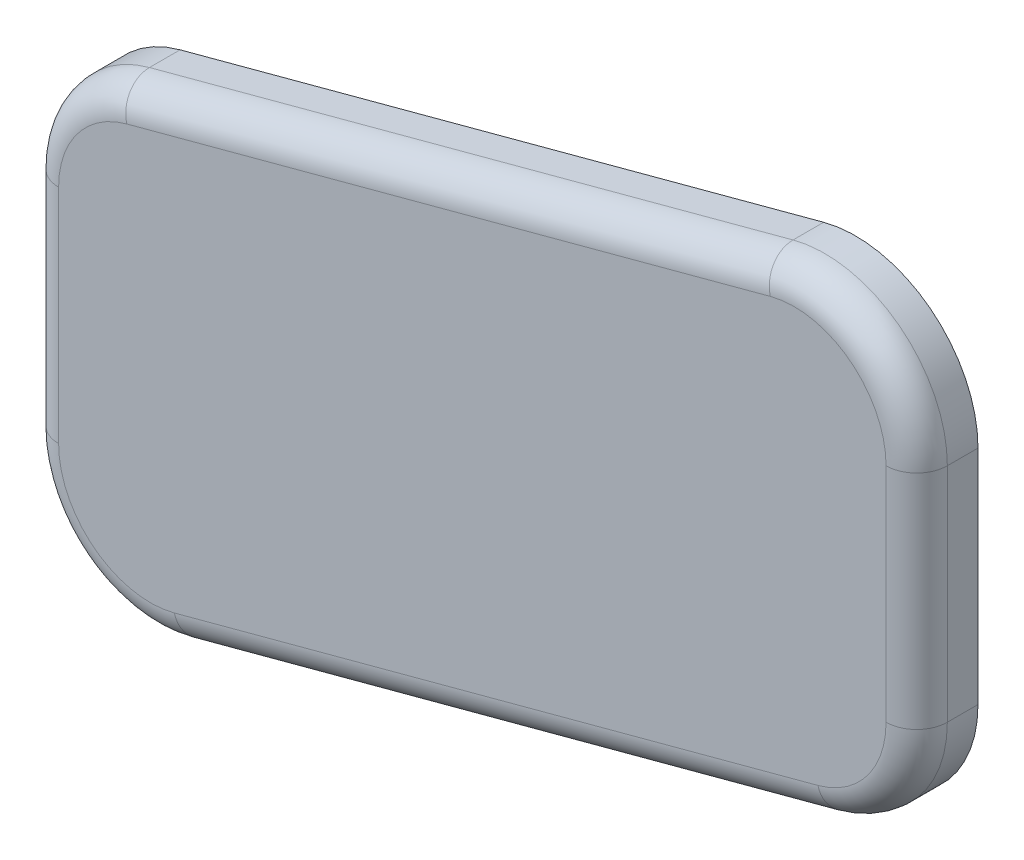
ISO-10303-21;
HEADER;
FILE_DESCRIPTION(('STEP AP214'),'2;1');
FILE_NAME('part.step','',(''),(''),'','','');
FILE_SCHEMA(('AUTOMOTIVE_DESIGN { 1 0 10303 214 1 1 1 1 }'));
ENDSEC;
DATA;
#1=APPLICATION_CONTEXT('core data for automotive mechanical design processes');
#2=APPLICATION_PROTOCOL_DEFINITION('international standard','automotive_design',2000,#1);
#3=PRODUCT_CONTEXT('',#1,'mechanical');
#4=PRODUCT('Part','Part','',(#3));
#5=PRODUCT_RELATED_PRODUCT_CATEGORY('part','',(#4));
#6=PRODUCT_DEFINITION_FORMATION('','',#4);
#7=PRODUCT_DEFINITION_CONTEXT('part definition',#1,'design');
#8=PRODUCT_DEFINITION('design','',#6,#7);
#9=PRODUCT_DEFINITION_SHAPE('','',#8);
#10=(LENGTH_UNIT() NAMED_UNIT(*) SI_UNIT(.MILLI.,.METRE.));
#11=(NAMED_UNIT(*) PLANE_ANGLE_UNIT() SI_UNIT($,.RADIAN.));
#12=(NAMED_UNIT(*) SI_UNIT($,.STERADIAN.) SOLID_ANGLE_UNIT());
#13=UNCERTAINTY_MEASURE_WITH_UNIT(LENGTH_MEASURE(1.E-05),#10,'distance_accuracy_value','');
#14=(GEOMETRIC_REPRESENTATION_CONTEXT(3) GLOBAL_UNCERTAINTY_ASSIGNED_CONTEXT((#13)) GLOBAL_UNIT_ASSIGNED_CONTEXT((#10,
#11,#12)) REPRESENTATION_CONTEXT('',''));
#15=CARTESIAN_POINT('',(0.,0.,0.));
#16=DIRECTION('',(0.,0.,1.));
#17=DIRECTION('',(1.,0.,0.));
#18=AXIS2_PLACEMENT_3D('',#15,#16,#17);
#19=CARTESIAN_POINT('',(0.,0.,2.));
#20=DIRECTION('',(1.,0.,0.));
#21=DIRECTION('',(0.,1.,0.));
#22=AXIS2_PLACEMENT_3D('',#19,#20,#21);
#23=PLANE('',#22);
#24=DIRECTION('',(0.,0.,-1.));
#25=VECTOR('',#24,1.);
#26=CARTESIAN_POINT('',(0.,5.21290149136481,2.));
#27=LINE('',#26,#25);
#28=CARTESIAN_POINT('',(0.,5.21290149136481,0.));
#29=VERTEX_POINT('',#28);
#30=CARTESIAN_POINT('',(0.,5.21290149136481,1.));
#31=VERTEX_POINT('',#30);
#32=EDGE_CURVE('E133',#29,#31,#27,.F.);
#33=ORIENTED_EDGE('',*,*,#32,.T.);
#34=DIRECTION('',(0.,-1.,0.));
#35=VECTOR('',#34,1.);
#36=CARTESIAN_POINT('',(0.,0.,1.));
#37=LINE('',#36,#35);
#38=CARTESIAN_POINT('',(0.,12.4598347542354,1.));
#39=VERTEX_POINT('',#38);
#40=EDGE_CURVE('E61',#31,#39,#37,.F.);
#41=ORIENTED_EDGE('',*,*,#40,.T.);
#42=DIRECTION('',(0.,0.,-1.));
#43=VECTOR('',#42,1.);
#44=CARTESIAN_POINT('',(0.,12.4598347542354,2.));
#45=LINE('',#44,#43);
#46=CARTESIAN_POINT('',(0.,12.4598347542354,0.));
#47=VERTEX_POINT('',#46);
#48=EDGE_CURVE('E126',#39,#47,#45,.T.);
#49=ORIENTED_EDGE('',*,*,#48,.T.);
#50=DIRECTION('',(0.,-1.,0.));
#51=VECTOR('',#50,1.);
#52=CARTESIAN_POINT('',(0.,0.,0.));
#53=LINE('',#52,#51);
#54=EDGE_CURVE('E129',#47,#29,#53,.T.);
#55=ORIENTED_EDGE('',*,*,#54,.T.);
#56=EDGE_LOOP('',(#33,#41,#49,#55));
#57=FACE_BOUND('',#56,.T.);
#58=ADVANCED_FACE('F37',(#57),#23,.F.);
#59=CARTESIAN_POINT('',(0.,0.,2.));
#60=DIRECTION('',(-0.258819045102518,0.965925826289069,0.));
#61=DIRECTION('',(-0.965925826289069,-0.258819045102518,0.));
#62=AXIS2_PLACEMENT_3D('',#59,#60,#61);
#63=PLANE('',#62);
#64=DIRECTION('',(0.,0.,-1.));
#65=VECTOR('',#64,1.);
#66=CARTESIAN_POINT('',(26.0352761804101,6.97613122726204,2.));
#67=LINE('',#66,#65);
#68=CARTESIAN_POINT('',(26.0352761804101,6.97613122726204,0.));
#69=VERTEX_POINT('',#68);
#70=CARTESIAN_POINT('',(26.0352761804101,6.97613122726204,1.));
#71=VERTEX_POINT('',#70);
#72=EDGE_CURVE('E166',#69,#71,#67,.F.);
#73=ORIENTED_EDGE('',*,*,#72,.T.);
#74=DIRECTION('',(0.965925826289069,0.258819045102518,0.));
#75=VECTOR('',#74,1.);
#76=CARTESIAN_POINT('',(0.,0.,1.));
#77=LINE('',#76,#75);
#78=CARTESIAN_POINT('',(5.03527618041007,1.34919818620853,1.));
#79=VERTEX_POINT('',#78);
#80=EDGE_CURVE('E200',#71,#79,#77,.F.);
#81=ORIENTED_EDGE('',*,*,#80,.T.);
#82=DIRECTION('',(0.,0.,-1.));
#83=VECTOR('',#82,1.);
#84=CARTESIAN_POINT('',(5.03527618041007,1.34919818620853,2.));
#85=LINE('',#84,#83);
#86=CARTESIAN_POINT('',(5.03527618041007,1.34919818620853,0.));
#87=VERTEX_POINT('',#86);
#88=EDGE_CURVE('E169',#79,#87,#85,.T.);
#89=ORIENTED_EDGE('',*,*,#88,.T.);
#90=DIRECTION('',(0.965925826289069,0.258819045102518,0.));
#91=VECTOR('',#90,1.);
#92=CARTESIAN_POINT('',(0.,0.,0.));
#93=LINE('',#92,#91);
#94=EDGE_CURVE('E147',#87,#69,#93,.T.);
#95=ORIENTED_EDGE('',*,*,#94,.T.);
#96=EDGE_LOOP('',(#73,#81,#89,#95));
#97=FACE_BOUND('',#96,.T.);
#98=ADVANCED_FACE('F277',(#97),#63,.F.);
#99=CARTESIAN_POINT('',(29.,7.77052658050247,2.));
#100=DIRECTION('',(-1.,0.,0.));
#101=DIRECTION('',(0.,-1.,0.));
#102=AXIS2_PLACEMENT_3D('',#99,#100,#101);
#103=PLANE('',#102);
#104=DIRECTION('',(0.,0.,-1.));
#105=VECTOR('',#104,1.);
#106=CARTESIAN_POINT('',(29.,18.0867677952889,2.));
#107=LINE('',#106,#105);
#108=CARTESIAN_POINT('',(29.,18.0867677952889,0.));
#109=VERTEX_POINT('',#108);
#110=CARTESIAN_POINT('',(29.,18.0867677952889,1.));
#111=VERTEX_POINT('',#110);
#112=EDGE_CURVE('E171',#109,#111,#107,.F.);
#113=ORIENTED_EDGE('',*,*,#112,.T.);
#114=DIRECTION('',(0.,1.,0.));
#115=VECTOR('',#114,1.);
#116=CARTESIAN_POINT('',(29.,7.77052658050247,1.));
#117=LINE('',#116,#115);
#118=CARTESIAN_POINT('',(29.,10.8398345324183,1.));
#119=VERTEX_POINT('',#118);
#120=EDGE_CURVE('E196',#111,#119,#117,.F.);
#121=ORIENTED_EDGE('',*,*,#120,.T.);
#122=DIRECTION('',(0.,0.,-1.));
#123=VECTOR('',#122,1.);
#124=CARTESIAN_POINT('',(29.,10.8398345324183,2.));
#125=LINE('',#124,#123);
#126=CARTESIAN_POINT('',(29.,10.8398345324183,0.));
#127=VERTEX_POINT('',#126);
#128=EDGE_CURVE('E174',#119,#127,#125,.T.);
#129=ORIENTED_EDGE('',*,*,#128,.T.);
#130=DIRECTION('',(0.,1.,0.));
#131=VECTOR('',#130,1.);
#132=CARTESIAN_POINT('',(29.,7.77052658050247,0.));
#133=LINE('',#132,#131);
#134=EDGE_CURVE('E150',#127,#109,#133,.T.);
#135=ORIENTED_EDGE('',*,*,#134,.T.);
#136=EDGE_LOOP('',(#113,#121,#129,#135));
#137=FACE_BOUND('',#136,.T.);
#138=ADVANCED_FACE('F262',(#137),#103,.F.);
#139=CARTESIAN_POINT('',(0.,15.5291427061512,2.));
#140=DIRECTION('',(0.258819045102518,-0.965925826289069,0.));
#141=DIRECTION('',(0.965925826289069,0.258819045102518,0.));
#142=AXIS2_PLACEMENT_3D('',#139,#140,#141);
#143=PLANE('',#142);
#144=DIRECTION('',(0.,0.,-1.));
#145=VECTOR('',#144,1.);
#146=CARTESIAN_POINT('',(2.96472381958993,16.3235380593917,2.));
#147=LINE('',#146,#145);
#148=CARTESIAN_POINT('',(2.96472381958993,16.3235380593917,0.));
#149=VERTEX_POINT('',#148);
#150=CARTESIAN_POINT('',(2.96472381958993,16.3235380593917,1.));
#151=VERTEX_POINT('',#150);
#152=EDGE_CURVE('E137',#149,#151,#147,.F.);
#153=ORIENTED_EDGE('',*,*,#152,.T.);
#154=DIRECTION('',(-0.965925826289069,-0.258819045102518,0.));
#155=VECTOR('',#154,1.);
#156=CARTESIAN_POINT('',(0.,15.5291427061512,1.));
#157=LINE('',#156,#155);
#158=CARTESIAN_POINT('',(23.9647238195899,21.9504711004452,1.));
#159=VERTEX_POINT('',#158);
#160=EDGE_CURVE('E11',#151,#159,#157,.F.);
#161=ORIENTED_EDGE('',*,*,#160,.T.);
#162=DIRECTION('',(0.,0.,-1.));
#163=VECTOR('',#162,1.);
#164=CARTESIAN_POINT('',(23.9647238195899,21.9504711004452,2.));
#165=LINE('',#164,#163);
#166=CARTESIAN_POINT('',(23.9647238195899,21.9504711004452,0.));
#167=VERTEX_POINT('',#166);
#168=EDGE_CURVE('E141',#159,#167,#165,.T.);
#169=ORIENTED_EDGE('',*,*,#168,.T.);
#170=DIRECTION('',(-0.965925826289069,-0.258819045102518,0.));
#171=VECTOR('',#170,1.);
#172=CARTESIAN_POINT('',(0.,15.5291427061512,0.));
#173=LINE('',#172,#171);
#174=EDGE_CURVE('E157',#167,#149,#173,.T.);
#175=ORIENTED_EDGE('',*,*,#174,.T.);
#176=EDGE_LOOP('',(#153,#161,#169,#175));
#177=FACE_BOUND('',#176,.T.);
#178=ADVANCED_FACE('F245',(#177),#143,.F.);
#179=CARTESIAN_POINT('',(0.,0.,2.));
#180=DIRECTION('',(0.,0.,-1.));
#181=DIRECTION('',(-1.,0.,0.));
#182=AXIS2_PLACEMENT_3D('',#179,#180,#181);
#183=PLANE('',#182);
#184=DIRECTION('',(0.,1.,0.));
#185=VECTOR('',#184,1.);
#186=CARTESIAN_POINT('',(28.,0.,2.));
#187=LINE('',#186,#185);
#188=CARTESIAN_POINT('',(28.,10.8398345324183,2.));
#189=VERTEX_POINT('',#188);
#190=CARTESIAN_POINT('',(28.,18.0867677952889,2.));
#191=VERTEX_POINT('',#190);
#192=EDGE_CURVE('E188',#189,#191,#187,.T.);
#193=ORIENTED_EDGE('',*,*,#192,.T.);
#194=CARTESIAN_POINT('',(25.,18.0867677952889,2.));
#195=DIRECTION('',(0.,0.,-1.));
#196=DIRECTION('',(-1.,0.,0.));
#197=AXIS2_PLACEMENT_3D('',#194,#195,#196);
#198=CIRCLE('',#197,3.);
#199=CARTESIAN_POINT('',(24.2235428646924,20.9845452741561,2.));
#200=VERTEX_POINT('',#199);
#201=EDGE_CURVE('E190',#191,#200,#198,.F.);
#202=ORIENTED_EDGE('',*,*,#201,.T.);
#203=DIRECTION('',(-0.965925826289069,-0.258819045102518,0.));
#204=VECTOR('',#203,1.);
#205=CARTESIAN_POINT('',(-3.62346663143525,13.522961568047,2.));
#206=LINE('',#205,#204);
#207=CARTESIAN_POINT('',(3.22354286469245,15.3576122331026,2.));
#208=VERTEX_POINT('',#207);
#209=EDGE_CURVE('E176',#200,#208,#206,.T.);
#210=ORIENTED_EDGE('',*,*,#209,.T.);
#211=CARTESIAN_POINT('',(4.,12.4598347542354,2.));
#212=DIRECTION('',(0.,0.,-1.));
#213=DIRECTION('',(-1.,0.,0.));
#214=AXIS2_PLACEMENT_3D('',#211,#212,#213);
#215=CIRCLE('',#214,3.);
#216=CARTESIAN_POINT('',(1.,12.4598347542354,2.));
#217=VERTEX_POINT('',#216);
#218=EDGE_CURVE('E178',#208,#217,#215,.F.);
#219=ORIENTED_EDGE('',*,*,#218,.T.);
#220=DIRECTION('',(0.,-1.,0.));
#221=VECTOR('',#220,1.);
#222=CARTESIAN_POINT('',(1.,0.,2.));
#223=LINE('',#222,#221);
#224=CARTESIAN_POINT('',(1.,5.21290149136481,2.));
#225=VERTEX_POINT('',#224);
#226=EDGE_CURVE('E180',#217,#225,#223,.T.);
#227=ORIENTED_EDGE('',*,*,#226,.T.);
#228=CARTESIAN_POINT('',(4.,5.21290149136481,2.));
#229=DIRECTION('',(0.,0.,-1.));
#230=DIRECTION('',(-1.,0.,0.));
#231=AXIS2_PLACEMENT_3D('',#228,#229,#230);
#232=CIRCLE('',#231,3.);
#233=CARTESIAN_POINT('',(4.77645713530756,2.3151240124976,2.));
#234=VERTEX_POINT('',#233);
#235=EDGE_CURVE('E182',#225,#234,#232,.F.);
#236=ORIENTED_EDGE('',*,*,#235,.T.);
#237=DIRECTION('',(0.965925826289069,0.258819045102518,0.));
#238=VECTOR('',#237,1.);
#239=CARTESIAN_POINT('',(-0.258819045102518,0.96592582628907,2.));
#240=LINE('',#239,#238);
#241=CARTESIAN_POINT('',(25.7764571353076,7.94205705355111,2.));
#242=VERTEX_POINT('',#241);
#243=EDGE_CURVE('E184',#234,#242,#240,.T.);
#244=ORIENTED_EDGE('',*,*,#243,.T.);
#245=CARTESIAN_POINT('',(25.,10.8398345324183,2.));
#246=DIRECTION('',(0.,0.,-1.));
#247=DIRECTION('',(-1.,0.,0.));
#248=AXIS2_PLACEMENT_3D('',#245,#246,#247);
#249=CIRCLE('',#248,3.);
#250=EDGE_CURVE('E186',#242,#189,#249,.F.);
#251=ORIENTED_EDGE('',*,*,#250,.T.);
#252=EDGE_LOOP('',(#193,#202,#210,#219,#227,#236,#244,#251));
#253=FACE_BOUND('',#252,.T.);
#254=ADVANCED_FACE('F232',(#253),#183,.F.);
#255=CARTESIAN_POINT('',(0.,0.,0.));
#256=DIRECTION('',(0.,0.,-1.));
#257=DIRECTION('',(-1.,0.,0.));
#258=AXIS2_PLACEMENT_3D('',#255,#256,#257);
#259=PLANE('',#258);
#260=ORIENTED_EDGE('',*,*,#54,.F.);
#261=CARTESIAN_POINT('',(4.,12.4598347542354,0.));
#262=DIRECTION('',(0.,0.,-1.));
#263=DIRECTION('',(-1.,0.,0.));
#264=AXIS2_PLACEMENT_3D('',#261,#262,#263);
#265=CIRCLE('',#264,4.);
#266=EDGE_CURVE('E135',#47,#149,#265,.T.);
#267=ORIENTED_EDGE('',*,*,#266,.T.);
#268=ORIENTED_EDGE('',*,*,#174,.F.);
#269=CARTESIAN_POINT('',(25.,18.0867677952889,0.));
#270=DIRECTION('',(0.,0.,-1.));
#271=DIRECTION('',(-1.,0.,0.));
#272=AXIS2_PLACEMENT_3D('',#269,#270,#271);
#273=CIRCLE('',#272,4.);
#274=EDGE_CURVE('E132',#167,#109,#273,.T.);
#275=ORIENTED_EDGE('',*,*,#274,.T.);
#276=ORIENTED_EDGE('',*,*,#134,.F.);
#277=CARTESIAN_POINT('',(25.,10.8398345324183,0.));
#278=DIRECTION('',(0.,0.,-1.));
#279=DIRECTION('',(-1.,0.,0.));
#280=AXIS2_PLACEMENT_3D('',#277,#278,#279);
#281=CIRCLE('',#280,4.);
#282=EDGE_CURVE('E161',#127,#69,#281,.T.);
#283=ORIENTED_EDGE('',*,*,#282,.T.);
#284=ORIENTED_EDGE('',*,*,#94,.F.);
#285=CARTESIAN_POINT('',(4.,5.21290149136481,0.));
#286=DIRECTION('',(0.,0.,-1.));
#287=DIRECTION('',(-1.,0.,0.));
#288=AXIS2_PLACEMENT_3D('',#285,#286,#287);
#289=CIRCLE('',#288,4.);
#290=EDGE_CURVE('E142',#87,#29,#289,.T.);
#291=ORIENTED_EDGE('',*,*,#290,.T.);
#292=EDGE_LOOP('',(#260,#267,#268,#275,#276,#283,#284,#291));
#293=FACE_BOUND('',#292,.T.);
#294=ADVANCED_FACE('F144',(#293),#259,.T.);
#295=CARTESIAN_POINT('',(4.,12.4598347542354,2.));
#296=DIRECTION('',(0.,0.,-1.));
#297=DIRECTION('',(-1.,0.,0.));
#298=AXIS2_PLACEMENT_3D('',#295,#296,#297);
#299=CYLINDRICAL_SURFACE('',#298,4.);
#300=ORIENTED_EDGE('',*,*,#48,.F.);
#301=CARTESIAN_POINT('',(4.,12.4598347542354,1.));
#302=DIRECTION('',(0.,0.,-1.));
#303=DIRECTION('',(-1.,0.,0.));
#304=AXIS2_PLACEMENT_3D('',#301,#302,#303);
#305=CIRCLE('',#304,4.);
#306=EDGE_CURVE('E46',#39,#151,#305,.T.);
#307=ORIENTED_EDGE('',*,*,#306,.T.);
#308=ORIENTED_EDGE('',*,*,#152,.F.);
#309=ORIENTED_EDGE('',*,*,#266,.F.);
#310=EDGE_LOOP('',(#300,#307,#308,#309));
#311=FACE_BOUND('',#310,.T.);
#312=ADVANCED_FACE('F136',(#311),#299,.T.);
#313=CARTESIAN_POINT('',(4.,5.21290149136481,2.));
#314=DIRECTION('',(0.,0.,-1.));
#315=DIRECTION('',(-1.,0.,0.));
#316=AXIS2_PLACEMENT_3D('',#313,#314,#315);
#317=CYLINDRICAL_SURFACE('',#316,4.);
#318=ORIENTED_EDGE('',*,*,#88,.F.);
#319=CARTESIAN_POINT('',(4.,5.21290149136481,1.));
#320=DIRECTION('',(0.,0.,-1.));
#321=DIRECTION('',(-1.,0.,0.));
#322=AXIS2_PLACEMENT_3D('',#319,#320,#321);
#323=CIRCLE('',#322,4.);
#324=EDGE_CURVE('E202',#79,#31,#323,.T.);
#325=ORIENTED_EDGE('',*,*,#324,.T.);
#326=ORIENTED_EDGE('',*,*,#32,.F.);
#327=ORIENTED_EDGE('',*,*,#290,.F.);
#328=EDGE_LOOP('',(#318,#325,#326,#327));
#329=FACE_BOUND('',#328,.T.);
#330=ADVANCED_FACE('F279',(#329),#317,.T.);
#331=CARTESIAN_POINT('',(25.,10.8398345324183,2.));
#332=DIRECTION('',(0.,0.,-1.));
#333=DIRECTION('',(-1.,0.,0.));
#334=AXIS2_PLACEMENT_3D('',#331,#332,#333);
#335=CYLINDRICAL_SURFACE('',#334,4.);
#336=ORIENTED_EDGE('',*,*,#128,.F.);
#337=CARTESIAN_POINT('',(25.,10.8398345324183,1.));
#338=DIRECTION('',(0.,0.,-1.));
#339=DIRECTION('',(-1.,0.,0.));
#340=AXIS2_PLACEMENT_3D('',#337,#338,#339);
#341=CIRCLE('',#340,4.);
#342=EDGE_CURVE('E198',#119,#71,#341,.T.);
#343=ORIENTED_EDGE('',*,*,#342,.T.);
#344=ORIENTED_EDGE('',*,*,#72,.F.);
#345=ORIENTED_EDGE('',*,*,#282,.F.);
#346=EDGE_LOOP('',(#336,#343,#344,#345));
#347=FACE_BOUND('',#346,.T.);
#348=ADVANCED_FACE('F266',(#347),#335,.T.);
#349=CARTESIAN_POINT('',(25.,18.0867677952889,2.));
#350=DIRECTION('',(0.,0.,-1.));
#351=DIRECTION('',(-1.,0.,0.));
#352=AXIS2_PLACEMENT_3D('',#349,#350,#351);
#353=CYLINDRICAL_SURFACE('',#352,4.);
#354=ORIENTED_EDGE('',*,*,#168,.F.);
#355=CARTESIAN_POINT('',(25.,18.0867677952889,1.));
#356=DIRECTION('',(0.,0.,-1.));
#357=DIRECTION('',(-1.,0.,0.));
#358=AXIS2_PLACEMENT_3D('',#355,#356,#357);
#359=CIRCLE('',#358,4.);
#360=EDGE_CURVE('E193',#159,#111,#359,.T.);
#361=ORIENTED_EDGE('',*,*,#360,.T.);
#362=ORIENTED_EDGE('',*,*,#112,.F.);
#363=ORIENTED_EDGE('',*,*,#274,.F.);
#364=EDGE_LOOP('',(#354,#361,#362,#363));
#365=FACE_BOUND('',#364,.T.);
#366=ADVANCED_FACE('F249',(#365),#353,.T.);
#367=CARTESIAN_POINT('',(4.,5.21290149136481,1.));
#368=DIRECTION('',(0.,0.,-1.));
#369=DIRECTION('',(-1.,0.,0.));
#370=AXIS2_PLACEMENT_3D('',#367,#368,#369);
#371=TOROIDAL_SURFACE('',#370,3.,1.);
#372=CARTESIAN_POINT('',(1.,5.21290149136481,1.));
#373=DIRECTION('',(0.,1.,0.));
#374=DIRECTION('',(0.,0.,1.));
#375=AXIS2_PLACEMENT_3D('',#372,#373,#374);
#376=CIRCLE('',#375,1.);
#377=EDGE_CURVE('E153',#31,#225,#376,.T.);
#378=ORIENTED_EDGE('',*,*,#377,.F.);
#379=ORIENTED_EDGE('',*,*,#324,.F.);
#380=CARTESIAN_POINT('',(4.77645713530756,2.3151240124976,1.));
#381=DIRECTION('',(0.965925826289069,0.258819045102518,0.));
#382=DIRECTION('',(-0.258819045102518,0.965925826289069,0.));
#383=AXIS2_PLACEMENT_3D('',#380,#381,#382);
#384=CIRCLE('',#383,1.);
#385=EDGE_CURVE('E41',#234,#79,#384,.T.);
#386=ORIENTED_EDGE('',*,*,#385,.F.);
#387=ORIENTED_EDGE('',*,*,#235,.F.);
#388=EDGE_LOOP('',(#378,#379,#386,#387));
#389=FACE_BOUND('',#388,.T.);
#390=ADVANCED_FACE('F39',(#389),#371,.T.);
#391=CARTESIAN_POINT('',(-0.258819045102518,0.965925826289069,1.));
#392=DIRECTION('',(0.965925826289069,0.258819045102518,0.));
#393=DIRECTION('',(-0.258819045102518,0.965925826289069,0.));
#394=AXIS2_PLACEMENT_3D('',#391,#392,#393);
#395=CYLINDRICAL_SURFACE('',#394,1.);
#396=ORIENTED_EDGE('',*,*,#385,.T.);
#397=ORIENTED_EDGE('',*,*,#80,.F.);
#398=CARTESIAN_POINT('',(25.7764571353076,7.94205705355111,1.));
#399=DIRECTION('',(0.965925826289069,0.258819045102519,0.));
#400=DIRECTION('',(-0.258819045102519,0.965925826289069,0.));
#401=AXIS2_PLACEMENT_3D('',#398,#399,#400);
#402=CIRCLE('',#401,1.);
#403=EDGE_CURVE('E219',#242,#71,#402,.T.);
#404=ORIENTED_EDGE('',*,*,#403,.F.);
#405=ORIENTED_EDGE('',*,*,#243,.F.);
#406=EDGE_LOOP('',(#396,#397,#404,#405));
#407=FACE_BOUND('',#406,.T.);
#408=ADVANCED_FACE('F274',(#407),#395,.T.);
#409=CARTESIAN_POINT('',(1.,0.,1.));
#410=DIRECTION('',(0.,-1.,0.));
#411=DIRECTION('',(1.,0.,0.));
#412=AXIS2_PLACEMENT_3D('',#409,#410,#411);
#413=CYLINDRICAL_SURFACE('',#412,1.);
#414=ORIENTED_EDGE('',*,*,#377,.T.);
#415=ORIENTED_EDGE('',*,*,#226,.F.);
#416=CARTESIAN_POINT('',(1.,12.4598347542354,1.));
#417=DIRECTION('',(0.,1.,0.));
#418=DIRECTION('',(0.,0.,1.));
#419=AXIS2_PLACEMENT_3D('',#416,#417,#418);
#420=CIRCLE('',#419,1.);
#421=EDGE_CURVE('E216',#39,#217,#420,.T.);
#422=ORIENTED_EDGE('',*,*,#421,.F.);
#423=ORIENTED_EDGE('',*,*,#40,.F.);
#424=EDGE_LOOP('',(#414,#415,#422,#423));
#425=FACE_BOUND('',#424,.T.);
#426=ADVANCED_FACE('F225',(#425),#413,.T.);
#427=CARTESIAN_POINT('',(25.,10.8398345324183,1.));
#428=DIRECTION('',(0.,0.,-1.));
#429=DIRECTION('',(-1.,0.,0.));
#430=AXIS2_PLACEMENT_3D('',#427,#428,#429);
#431=TOROIDAL_SURFACE('',#430,3.,1.);
#432=ORIENTED_EDGE('',*,*,#403,.T.);
#433=ORIENTED_EDGE('',*,*,#342,.F.);
#434=CARTESIAN_POINT('',(28.,10.8398345324183,1.));
#435=DIRECTION('',(0.,1.,0.));
#436=DIRECTION('',(0.,0.,1.));
#437=AXIS2_PLACEMENT_3D('',#434,#435,#436);
#438=CIRCLE('',#437,1.);
#439=EDGE_CURVE('E213',#189,#119,#438,.T.);
#440=ORIENTED_EDGE('',*,*,#439,.F.);
#441=ORIENTED_EDGE('',*,*,#250,.F.);
#442=EDGE_LOOP('',(#432,#433,#440,#441));
#443=FACE_BOUND('',#442,.T.);
#444=ADVANCED_FACE('F270',(#443),#431,.T.);
#445=CARTESIAN_POINT('',(4.,12.4598347542354,1.));
#446=DIRECTION('',(0.,0.,-1.));
#447=DIRECTION('',(-1.,0.,0.));
#448=AXIS2_PLACEMENT_3D('',#445,#446,#447);
#449=TOROIDAL_SURFACE('',#448,3.,1.);
#450=ORIENTED_EDGE('',*,*,#421,.T.);
#451=ORIENTED_EDGE('',*,*,#218,.F.);
#452=CARTESIAN_POINT('',(3.22354286469245,15.3576122331026,1.));
#453=DIRECTION('',(0.965925826289069,0.258819045102518,0.));
#454=DIRECTION('',(-0.258819045102518,0.965925826289069,0.));
#455=AXIS2_PLACEMENT_3D('',#452,#453,#454);
#456=CIRCLE('',#455,1.);
#457=EDGE_CURVE('E210',#151,#208,#456,.T.);
#458=ORIENTED_EDGE('',*,*,#457,.F.);
#459=ORIENTED_EDGE('',*,*,#306,.F.);
#460=EDGE_LOOP('',(#450,#451,#458,#459));
#461=FACE_BOUND('',#460,.T.);
#462=ADVANCED_FACE('F238',(#461),#449,.T.);
#463=CARTESIAN_POINT('',(28.,0.,1.));
#464=DIRECTION('',(0.,1.,0.));
#465=DIRECTION('',(-1.,0.,0.));
#466=AXIS2_PLACEMENT_3D('',#463,#464,#465);
#467=CYLINDRICAL_SURFACE('',#466,1.);
#468=ORIENTED_EDGE('',*,*,#439,.T.);
#469=ORIENTED_EDGE('',*,*,#120,.F.);
#470=CARTESIAN_POINT('',(28.,18.0867677952889,1.));
#471=DIRECTION('',(0.,1.,0.));
#472=DIRECTION('',(0.,0.,1.));
#473=AXIS2_PLACEMENT_3D('',#470,#471,#472);
#474=CIRCLE('',#473,1.);
#475=EDGE_CURVE('E208',#191,#111,#474,.T.);
#476=ORIENTED_EDGE('',*,*,#475,.F.);
#477=ORIENTED_EDGE('',*,*,#192,.F.);
#478=EDGE_LOOP('',(#468,#469,#476,#477));
#479=FACE_BOUND('',#478,.T.);
#480=ADVANCED_FACE('F258',(#479),#467,.T.);
#481=CARTESIAN_POINT('',(-3.62346663143525,13.522961568047,1.));
#482=DIRECTION('',(-0.965925826289069,-0.258819045102518,0.));
#483=DIRECTION('',(0.258819045102518,-0.965925826289069,0.));
#484=AXIS2_PLACEMENT_3D('',#481,#482,#483);
#485=CYLINDRICAL_SURFACE('',#484,1.);
#486=ORIENTED_EDGE('',*,*,#457,.T.);
#487=ORIENTED_EDGE('',*,*,#209,.F.);
#488=CARTESIAN_POINT('',(24.2235428646924,20.9845452741561,1.));
#489=DIRECTION('',(0.965925826289069,0.25881904510252,0.));
#490=DIRECTION('',(-0.25881904510252,0.965925826289069,0.));
#491=AXIS2_PLACEMENT_3D('',#488,#489,#490);
#492=CIRCLE('',#491,1.);
#493=EDGE_CURVE('E206',#159,#200,#492,.T.);
#494=ORIENTED_EDGE('',*,*,#493,.F.);
#495=ORIENTED_EDGE('',*,*,#160,.F.);
#496=EDGE_LOOP('',(#486,#487,#494,#495));
#497=FACE_BOUND('',#496,.T.);
#498=ADVANCED_FACE('F241',(#497),#485,.T.);
#499=CARTESIAN_POINT('',(25.,18.0867677952889,1.));
#500=DIRECTION('',(0.,0.,-1.));
#501=DIRECTION('',(-1.,0.,0.));
#502=AXIS2_PLACEMENT_3D('',#499,#500,#501);
#503=TOROIDAL_SURFACE('',#502,3.,1.);
#504=ORIENTED_EDGE('',*,*,#475,.T.);
#505=ORIENTED_EDGE('',*,*,#360,.F.);
#506=ORIENTED_EDGE('',*,*,#493,.T.);
#507=ORIENTED_EDGE('',*,*,#201,.F.);
#508=EDGE_LOOP('',(#504,#505,#506,#507));
#509=FACE_BOUND('',#508,.T.);
#510=ADVANCED_FACE('F252',(#509),#503,.T.);
#511=CLOSED_SHELL('',(#58,#98,#138,#178,#254,#294,#312,#330,#348,#366,#390,#408,#426,#444,#462,
#480,#498,#510));
#512=MANIFOLD_SOLID_BREP('B2',#511);
#513=ADVANCED_BREP_SHAPE_REPRESENTATION('',(#18,#512),#14);
#514=SHAPE_DEFINITION_REPRESENTATION(#9,#513);
ENDSEC;
END-ISO-10303-21;
